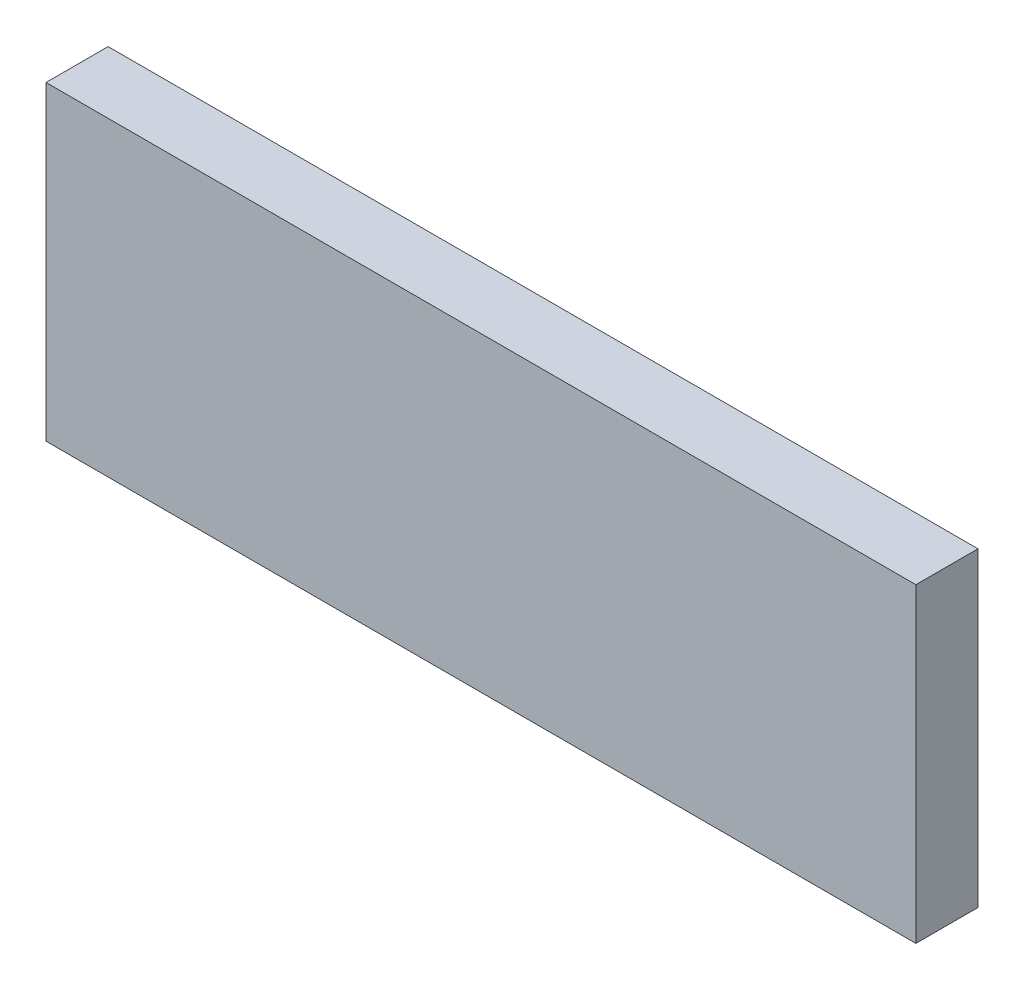
ISO-10303-21;
HEADER;
FILE_DESCRIPTION(('STEP AP214'),'2;1');
FILE_NAME('part.step','',(''),(''),'','','');
FILE_SCHEMA(('AUTOMOTIVE_DESIGN { 1 0 10303 214 1 1 1 1 }'));
ENDSEC;
DATA;
#1=APPLICATION_CONTEXT('core data for automotive mechanical design processes');
#2=APPLICATION_PROTOCOL_DEFINITION('international standard','automotive_design',2000,#1);
#3=PRODUCT_CONTEXT('',#1,'mechanical');
#4=PRODUCT('Part','Part','',(#3));
#5=PRODUCT_RELATED_PRODUCT_CATEGORY('part','',(#4));
#6=PRODUCT_DEFINITION_FORMATION('','',#4);
#7=PRODUCT_DEFINITION_CONTEXT('part definition',#1,'design');
#8=PRODUCT_DEFINITION('design','',#6,#7);
#9=PRODUCT_DEFINITION_SHAPE('','',#8);
#10=(LENGTH_UNIT() NAMED_UNIT(*) SI_UNIT(.MILLI.,.METRE.));
#11=(NAMED_UNIT(*) PLANE_ANGLE_UNIT() SI_UNIT($,.RADIAN.));
#12=(NAMED_UNIT(*) SI_UNIT($,.STERADIAN.) SOLID_ANGLE_UNIT());
#13=UNCERTAINTY_MEASURE_WITH_UNIT(LENGTH_MEASURE(1.E-05),#10,'distance_accuracy_value','');
#14=(GEOMETRIC_REPRESENTATION_CONTEXT(3) GLOBAL_UNCERTAINTY_ASSIGNED_CONTEXT((#13)) GLOBAL_UNIT_ASSIGNED_CONTEXT((#10,
#11,#12)) REPRESENTATION_CONTEXT('',''));
#15=CARTESIAN_POINT('',(0.,0.,0.));
#16=DIRECTION('',(0.,0.,1.));
#17=DIRECTION('',(1.,0.,0.));
#18=AXIS2_PLACEMENT_3D('',#15,#16,#17);
#19=CARTESIAN_POINT('',(0.70000114,0.25000204,0.0999998));
#20=DIRECTION('',(0.,0.,1.));
#21=DIRECTION('',(1.,0.,0.));
#22=AXIS2_PLACEMENT_3D('',#19,#20,#21);
#23=PLANE('',#22);
#24=DIRECTION('',(1.,0.,0.));
#25=VECTOR('',#24,1.);
#26=CARTESIAN_POINT('',(0.70000114,-0.2499995,0.0999998));
#27=LINE('',#26,#25);
#28=CARTESIAN_POINT('',(0.70000114,-0.2499995,0.0999998));
#29=VERTEX_POINT('',#28);
#30=CARTESIAN_POINT('',(-0.70000114,-0.2499995,0.0999998));
#31=VERTEX_POINT('',#30);
#32=EDGE_CURVE('E52',#29,#31,#27,.F.);
#33=ORIENTED_EDGE('',*,*,#32,.F.);
#34=DIRECTION('',(0.,1.,0.));
#35=VECTOR('',#34,1.);
#36=CARTESIAN_POINT('',(0.70000114,0.25000204,0.0999998));
#37=LINE('',#36,#35);
#38=CARTESIAN_POINT('',(0.70000114,0.25000204,0.0999998));
#39=VERTEX_POINT('',#38);
#40=EDGE_CURVE('E19',#29,#39,#37,.T.);
#41=ORIENTED_EDGE('',*,*,#40,.T.);
#42=DIRECTION('',(1.,0.,0.));
#43=VECTOR('',#42,1.);
#44=CARTESIAN_POINT('',(-0.70000114,0.25000204,0.0999998));
#45=LINE('',#44,#43);
#46=CARTESIAN_POINT('',(-0.70000114,0.25000204,0.0999998));
#47=VERTEX_POINT('',#46);
#48=EDGE_CURVE('E66',#47,#39,#45,.T.);
#49=ORIENTED_EDGE('',*,*,#48,.F.);
#50=DIRECTION('',(0.,1.,0.));
#51=VECTOR('',#50,1.);
#52=CARTESIAN_POINT('',(-0.70000114,-0.2499995,0.0999998));
#53=LINE('',#52,#51);
#54=EDGE_CURVE('E57',#31,#47,#53,.T.);
#55=ORIENTED_EDGE('',*,*,#54,.F.);
#56=EDGE_LOOP('',(#33,#41,#49,#55));
#57=FACE_BOUND('',#56,.T.);
#58=ADVANCED_FACE('F16',(#57),#23,.T.);
#59=CARTESIAN_POINT('',(-0.70000114,0.25000204,0.));
#60=DIRECTION('',(0.,1.,0.));
#61=DIRECTION('',(0.,0.,1.));
#62=AXIS2_PLACEMENT_3D('',#59,#60,#61);
#63=PLANE('',#62);
#64=DIRECTION('',(0.,0.,-1.));
#65=VECTOR('',#64,1.);
#66=CARTESIAN_POINT('',(0.70000114,0.25000204,0.));
#67=LINE('',#66,#65);
#68=CARTESIAN_POINT('',(0.70000114,0.25000204,0.));
#69=VERTEX_POINT('',#68);
#70=EDGE_CURVE('E79',#69,#39,#67,.F.);
#71=ORIENTED_EDGE('',*,*,#70,.F.);
#72=DIRECTION('',(1.,0.,0.));
#73=VECTOR('',#72,1.);
#74=CARTESIAN_POINT('',(0.70000114,0.25000204,0.));
#75=LINE('',#74,#73);
#76=CARTESIAN_POINT('',(-0.70000114,0.25000204,0.));
#77=VERTEX_POINT('',#76);
#78=EDGE_CURVE('E74',#69,#77,#75,.F.);
#79=ORIENTED_EDGE('',*,*,#78,.T.);
#80=DIRECTION('',(0.,0.,1.));
#81=VECTOR('',#80,1.);
#82=CARTESIAN_POINT('',(-0.70000114,0.25000204,0.));
#83=LINE('',#82,#81);
#84=EDGE_CURVE('E62',#47,#77,#83,.F.);
#85=ORIENTED_EDGE('',*,*,#84,.F.);
#86=ORIENTED_EDGE('',*,*,#48,.T.);
#87=EDGE_LOOP('',(#71,#79,#85,#86));
#88=FACE_BOUND('',#87,.T.);
#89=ADVANCED_FACE('F73',(#88),#63,.T.);
#90=CARTESIAN_POINT('',(-0.70000114,-0.2499995,0.));
#91=DIRECTION('',(-1.,0.,0.));
#92=DIRECTION('',(0.,0.,1.));
#93=AXIS2_PLACEMENT_3D('',#90,#91,#92);
#94=PLANE('',#93);
#95=ORIENTED_EDGE('',*,*,#84,.T.);
#96=DIRECTION('',(0.,1.,0.));
#97=VECTOR('',#96,1.);
#98=CARTESIAN_POINT('',(-0.70000114,0.25000204,0.));
#99=LINE('',#98,#97);
#100=CARTESIAN_POINT('',(-0.70000114,-0.2499995,0.));
#101=VERTEX_POINT('',#100);
#102=EDGE_CURVE('E83',#77,#101,#99,.F.);
#103=ORIENTED_EDGE('',*,*,#102,.T.);
#104=DIRECTION('',(0.,0.,-1.));
#105=VECTOR('',#104,1.);
#106=CARTESIAN_POINT('',(-0.70000114,-0.2499995,0.));
#107=LINE('',#106,#105);
#108=EDGE_CURVE('E64',#31,#101,#107,.T.);
#109=ORIENTED_EDGE('',*,*,#108,.F.);
#110=ORIENTED_EDGE('',*,*,#54,.T.);
#111=EDGE_LOOP('',(#95,#103,#109,#110));
#112=FACE_BOUND('',#111,.T.);
#113=ADVANCED_FACE('F59',(#112),#94,.T.);
#114=CARTESIAN_POINT('',(0.70000114,-0.2499995,0.));
#115=DIRECTION('',(0.,-1.,0.));
#116=DIRECTION('',(0.,0.,-1.));
#117=AXIS2_PLACEMENT_3D('',#114,#115,#116);
#118=PLANE('',#117);
#119=ORIENTED_EDGE('',*,*,#108,.T.);
#120=DIRECTION('',(1.,0.,0.));
#121=VECTOR('',#120,1.);
#122=CARTESIAN_POINT('',(0.70000114,-0.2499995,0.));
#123=LINE('',#122,#121);
#124=CARTESIAN_POINT('',(0.70000114,-0.2499995,0.));
#125=VERTEX_POINT('',#124);
#126=EDGE_CURVE('E25',#101,#125,#123,.T.);
#127=ORIENTED_EDGE('',*,*,#126,.T.);
#128=DIRECTION('',(0.,0.,-1.));
#129=VECTOR('',#128,1.);
#130=CARTESIAN_POINT('',(0.70000114,-0.2499995,0.));
#131=LINE('',#130,#129);
#132=EDGE_CURVE('E33',#29,#125,#131,.T.);
#133=ORIENTED_EDGE('',*,*,#132,.F.);
#134=ORIENTED_EDGE('',*,*,#32,.T.);
#135=EDGE_LOOP('',(#119,#127,#133,#134));
#136=FACE_BOUND('',#135,.T.);
#137=ADVANCED_FACE('F87',(#136),#118,.T.);
#138=CARTESIAN_POINT('',(0.70000114,0.25000204,0.));
#139=DIRECTION('',(1.,0.,0.));
#140=DIRECTION('',(0.,0.,-1.));
#141=AXIS2_PLACEMENT_3D('',#138,#139,#140);
#142=PLANE('',#141);
#143=ORIENTED_EDGE('',*,*,#132,.T.);
#144=DIRECTION('',(0.,1.,0.));
#145=VECTOR('',#144,1.);
#146=CARTESIAN_POINT('',(0.70000114,0.25000204,0.));
#147=LINE('',#146,#145);
#148=EDGE_CURVE('E11',#125,#69,#147,.T.);
#149=ORIENTED_EDGE('',*,*,#148,.T.);
#150=ORIENTED_EDGE('',*,*,#70,.T.);
#151=ORIENTED_EDGE('',*,*,#40,.F.);
#152=EDGE_LOOP('',(#143,#149,#150,#151));
#153=FACE_BOUND('',#152,.T.);
#154=ADVANCED_FACE('F90',(#153),#142,.T.);
#155=CARTESIAN_POINT('',(0.70000114,0.25000204,0.));
#156=DIRECTION('',(0.,0.,1.));
#157=DIRECTION('',(1.,0.,0.));
#158=AXIS2_PLACEMENT_3D('',#155,#156,#157);
#159=PLANE('',#158);
#160=ORIENTED_EDGE('',*,*,#126,.F.);
#161=ORIENTED_EDGE('',*,*,#102,.F.);
#162=ORIENTED_EDGE('',*,*,#78,.F.);
#163=ORIENTED_EDGE('',*,*,#148,.F.);
#164=EDGE_LOOP('',(#160,#161,#162,#163));
#165=FACE_BOUND('',#164,.T.);
#166=ADVANCED_FACE('F89',(#165),#159,.F.);
#167=CLOSED_SHELL('',(#58,#89,#113,#137,#154,#166));
#168=MANIFOLD_SOLID_BREP('B1',#167);
#169=ADVANCED_BREP_SHAPE_REPRESENTATION('',(#18,#168),#14);
#170=SHAPE_DEFINITION_REPRESENTATION(#9,#169);
ENDSEC;
END-ISO-10303-21;
